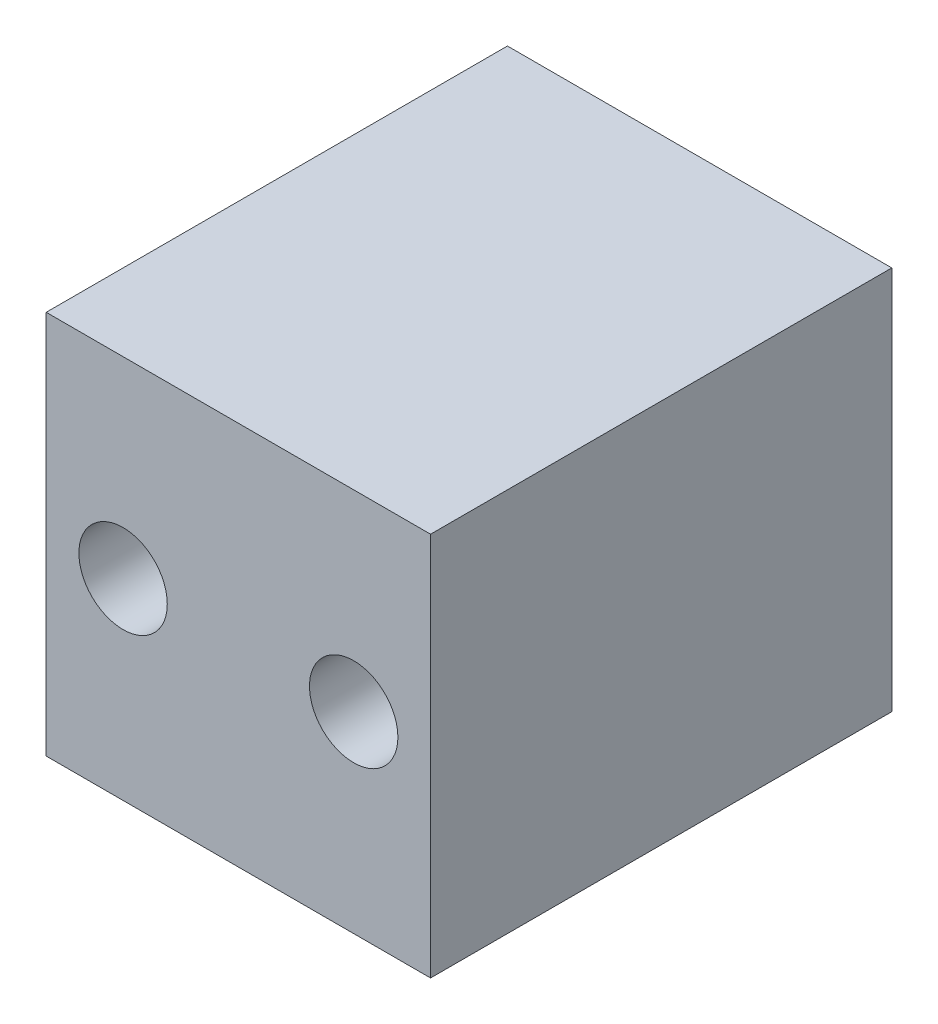
ISO-10303-21;
HEADER;
FILE_DESCRIPTION(('STEP AP214'),'2;1');
FILE_NAME('part.step','',(''),(''),'','','');
FILE_SCHEMA(('AUTOMOTIVE_DESIGN { 1 0 10303 214 1 1 1 1 }'));
ENDSEC;
DATA;
#1=APPLICATION_CONTEXT('core data for automotive mechanical design processes');
#2=APPLICATION_PROTOCOL_DEFINITION('international standard','automotive_design',2000,#1);
#3=PRODUCT_CONTEXT('',#1,'mechanical');
#4=PRODUCT('Part','Part','',(#3));
#5=PRODUCT_RELATED_PRODUCT_CATEGORY('part','',(#4));
#6=PRODUCT_DEFINITION_FORMATION('','',#4);
#7=PRODUCT_DEFINITION_CONTEXT('part definition',#1,'design');
#8=PRODUCT_DEFINITION('design','',#6,#7);
#9=PRODUCT_DEFINITION_SHAPE('','',#8);
#10=(LENGTH_UNIT() NAMED_UNIT(*) SI_UNIT(.MILLI.,.METRE.));
#11=(NAMED_UNIT(*) PLANE_ANGLE_UNIT() SI_UNIT($,.RADIAN.));
#12=(NAMED_UNIT(*) SI_UNIT($,.STERADIAN.) SOLID_ANGLE_UNIT());
#13=UNCERTAINTY_MEASURE_WITH_UNIT(LENGTH_MEASURE(1.E-05),#10,'distance_accuracy_value','');
#14=(GEOMETRIC_REPRESENTATION_CONTEXT(3) GLOBAL_UNCERTAINTY_ASSIGNED_CONTEXT((#13)) GLOBAL_UNIT_ASSIGNED_CONTEXT((#10,
#11,#12)) REPRESENTATION_CONTEXT('',''));
#15=CARTESIAN_POINT('',(0.,0.,0.));
#16=DIRECTION('',(0.,0.,1.));
#17=DIRECTION('',(1.,0.,0.));
#18=AXIS2_PLACEMENT_3D('',#15,#16,#17);
#19=CARTESIAN_POINT('',(-50.,-50.,120.));
#20=DIRECTION('',(1.,0.,0.));
#21=DIRECTION('',(0.,0.,-1.));
#22=AXIS2_PLACEMENT_3D('',#19,#20,#21);
#23=PLANE('',#22);
#24=DIRECTION('',(0.,-1.,0.));
#25=VECTOR('',#24,1.);
#26=CARTESIAN_POINT('',(-50.,-50.,0.));
#27=LINE('',#26,#25);
#28=CARTESIAN_POINT('',(-50.,50.,0.));
#29=VERTEX_POINT('',#28);
#30=CARTESIAN_POINT('',(-50.,-50.,0.));
#31=VERTEX_POINT('',#30);
#32=EDGE_CURVE('E96',#29,#31,#27,.T.);
#33=ORIENTED_EDGE('',*,*,#32,.T.);
#34=DIRECTION('',(0.,0.,-1.));
#35=VECTOR('',#34,1.);
#36=CARTESIAN_POINT('',(-50.,-50.,120.));
#37=LINE('',#36,#35);
#38=CARTESIAN_POINT('',(-50.,-50.,120.));
#39=VERTEX_POINT('',#38);
#40=EDGE_CURVE('E11',#39,#31,#37,.T.);
#41=ORIENTED_EDGE('',*,*,#40,.F.);
#42=DIRECTION('',(0.,-1.,0.));
#43=VECTOR('',#42,1.);
#44=CARTESIAN_POINT('',(-50.,-50.,120.));
#45=LINE('',#44,#43);
#46=CARTESIAN_POINT('',(-50.,50.,120.));
#47=VERTEX_POINT('',#46);
#48=EDGE_CURVE('E84',#47,#39,#45,.T.);
#49=ORIENTED_EDGE('',*,*,#48,.F.);
#50=DIRECTION('',(0.,0.,-1.));
#51=VECTOR('',#50,1.);
#52=CARTESIAN_POINT('',(-50.,50.,120.));
#53=LINE('',#52,#51);
#54=EDGE_CURVE('E92',#47,#29,#53,.T.);
#55=ORIENTED_EDGE('',*,*,#54,.T.);
#56=EDGE_LOOP('',(#33,#41,#49,#55));
#57=FACE_BOUND('',#56,.T.);
#58=ADVANCED_FACE('F33',(#57),#23,.F.);
#59=CARTESIAN_POINT('',(50.,-50.,120.));
#60=DIRECTION('',(0.,1.,0.));
#61=DIRECTION('',(-1.,0.,0.));
#62=AXIS2_PLACEMENT_3D('',#59,#60,#61);
#63=PLANE('',#62);
#64=DIRECTION('',(1.,0.,0.));
#65=VECTOR('',#64,1.);
#66=CARTESIAN_POINT('',(50.,-50.,0.));
#67=LINE('',#66,#65);
#68=CARTESIAN_POINT('',(50.,-50.,0.));
#69=VERTEX_POINT('',#68);
#70=EDGE_CURVE('E88',#31,#69,#67,.T.);
#71=ORIENTED_EDGE('',*,*,#70,.T.);
#72=DIRECTION('',(0.,0.,-1.));
#73=VECTOR('',#72,1.);
#74=CARTESIAN_POINT('',(50.,-50.,120.));
#75=LINE('',#74,#73);
#76=CARTESIAN_POINT('',(50.,-50.,120.));
#77=VERTEX_POINT('',#76);
#78=EDGE_CURVE('E41',#77,#69,#75,.T.);
#79=ORIENTED_EDGE('',*,*,#78,.F.);
#80=DIRECTION('',(1.,0.,0.));
#81=VECTOR('',#80,1.);
#82=CARTESIAN_POINT('',(50.,-50.,120.));
#83=LINE('',#82,#81);
#84=EDGE_CURVE('E79',#39,#77,#83,.T.);
#85=ORIENTED_EDGE('',*,*,#84,.F.);
#86=ORIENTED_EDGE('',*,*,#40,.T.);
#87=EDGE_LOOP('',(#71,#79,#85,#86));
#88=FACE_BOUND('',#87,.T.);
#89=ADVANCED_FACE('F87',(#88),#63,.F.);
#90=CARTESIAN_POINT('',(50.,-50.,120.));
#91=DIRECTION('',(-1.,0.,0.));
#92=DIRECTION('',(0.,0.,1.));
#93=AXIS2_PLACEMENT_3D('',#90,#91,#92);
#94=PLANE('',#93);
#95=DIRECTION('',(0.,1.,0.));
#96=VECTOR('',#95,1.);
#97=CARTESIAN_POINT('',(50.,-50.,0.));
#98=LINE('',#97,#96);
#99=CARTESIAN_POINT('',(50.,50.,0.));
#100=VERTEX_POINT('',#99);
#101=EDGE_CURVE('E66',#69,#100,#98,.T.);
#102=ORIENTED_EDGE('',*,*,#101,.T.);
#103=DIRECTION('',(0.,0.,-1.));
#104=VECTOR('',#103,1.);
#105=CARTESIAN_POINT('',(50.,50.,120.));
#106=LINE('',#105,#104);
#107=CARTESIAN_POINT('',(50.,50.,120.));
#108=VERTEX_POINT('',#107);
#109=EDGE_CURVE('E89',#108,#100,#106,.T.);
#110=ORIENTED_EDGE('',*,*,#109,.F.);
#111=DIRECTION('',(0.,1.,0.));
#112=VECTOR('',#111,1.);
#113=CARTESIAN_POINT('',(50.,-50.,120.));
#114=LINE('',#113,#112);
#115=EDGE_CURVE('E82',#77,#108,#114,.T.);
#116=ORIENTED_EDGE('',*,*,#115,.F.);
#117=ORIENTED_EDGE('',*,*,#78,.T.);
#118=EDGE_LOOP('',(#102,#110,#116,#117));
#119=FACE_BOUND('',#118,.T.);
#120=ADVANCED_FACE('F90',(#119),#94,.F.);
#121=CARTESIAN_POINT('',(50.,50.,120.));
#122=DIRECTION('',(0.,-1.,0.));
#123=DIRECTION('',(1.,0.,0.));
#124=AXIS2_PLACEMENT_3D('',#121,#122,#123);
#125=PLANE('',#124);
#126=DIRECTION('',(-1.,0.,0.));
#127=VECTOR('',#126,1.);
#128=CARTESIAN_POINT('',(50.,50.,0.));
#129=LINE('',#128,#127);
#130=EDGE_CURVE('E72',#100,#29,#129,.T.);
#131=ORIENTED_EDGE('',*,*,#130,.T.);
#132=ORIENTED_EDGE('',*,*,#54,.F.);
#133=DIRECTION('',(-1.,0.,0.));
#134=VECTOR('',#133,1.);
#135=CARTESIAN_POINT('',(50.,50.,120.));
#136=LINE('',#135,#134);
#137=EDGE_CURVE('E49',#108,#47,#136,.T.);
#138=ORIENTED_EDGE('',*,*,#137,.F.);
#139=ORIENTED_EDGE('',*,*,#109,.T.);
#140=EDGE_LOOP('',(#131,#132,#138,#139));
#141=FACE_BOUND('',#140,.T.);
#142=ADVANCED_FACE('F104',(#141),#125,.F.);
#143=CARTESIAN_POINT('',(0.,0.,120.));
#144=DIRECTION('',(0.,0.,1.));
#145=DIRECTION('',(1.,0.,0.));
#146=AXIS2_PLACEMENT_3D('',#143,#144,#145);
#147=PLANE('',#146);
#148=CARTESIAN_POINT('',(30.,0.,120.));
#149=DIRECTION('',(0.,0.,1.));
#150=DIRECTION('',(1.,0.,0.));
#151=AXIS2_PLACEMENT_3D('',#148,#149,#150);
#152=CIRCLE('',#151,11.5);
#153=CARTESIAN_POINT('',(41.5,0.,120.));
#154=VERTEX_POINT('',#153);
#155=EDGE_CURVE('E130',#154,#154,#152,.T.);
#156=ORIENTED_EDGE('',*,*,#155,.F.);
#157=EDGE_LOOP('',(#156));
#158=FACE_BOUND('',#157,.T.);
#159=CARTESIAN_POINT('',(-30.,0.,120.));
#160=DIRECTION('',(0.,0.,1.));
#161=DIRECTION('',(1.,0.,0.));
#162=AXIS2_PLACEMENT_3D('',#159,#160,#161);
#163=CIRCLE('',#162,11.5);
#164=CARTESIAN_POINT('',(-18.5,0.,120.));
#165=VERTEX_POINT('',#164);
#166=EDGE_CURVE('E118',#165,#165,#163,.T.);
#167=ORIENTED_EDGE('',*,*,#166,.F.);
#168=EDGE_LOOP('',(#167));
#169=FACE_BOUND('',#168,.T.);
#170=ORIENTED_EDGE('',*,*,#48,.T.);
#171=ORIENTED_EDGE('',*,*,#84,.T.);
#172=ORIENTED_EDGE('',*,*,#115,.T.);
#173=ORIENTED_EDGE('',*,*,#137,.T.);
#174=EDGE_LOOP('',(#170,#171,#172,#173));
#175=FACE_BOUND('',#174,.T.);
#176=ADVANCED_FACE('F80',(#158,#169,#175),#147,.T.);
#177=CARTESIAN_POINT('',(0.,0.,0.));
#178=DIRECTION('',(0.,0.,1.));
#179=DIRECTION('',(1.,0.,0.));
#180=AXIS2_PLACEMENT_3D('',#177,#178,#179);
#181=PLANE('',#180);
#182=CARTESIAN_POINT('',(30.,0.,0.));
#183=DIRECTION('',(0.,0.,1.));
#184=DIRECTION('',(1.,0.,0.));
#185=AXIS2_PLACEMENT_3D('',#182,#183,#184);
#186=CIRCLE('',#185,4.49999999999997);
#187=CARTESIAN_POINT('',(34.5,0.,0.));
#188=VERTEX_POINT('',#187);
#189=EDGE_CURVE('E121',#188,#188,#186,.T.);
#190=ORIENTED_EDGE('',*,*,#189,.T.);
#191=EDGE_LOOP('',(#190));
#192=FACE_BOUND('',#191,.T.);
#193=CARTESIAN_POINT('',(-30.,0.,0.));
#194=DIRECTION('',(0.,0.,1.));
#195=DIRECTION('',(1.,0.,0.));
#196=AXIS2_PLACEMENT_3D('',#193,#194,#195);
#197=CIRCLE('',#196,4.49999999999997);
#198=CARTESIAN_POINT('',(-25.5,0.,0.));
#199=VERTEX_POINT('',#198);
#200=EDGE_CURVE('E99',#199,#199,#197,.T.);
#201=ORIENTED_EDGE('',*,*,#200,.T.);
#202=EDGE_LOOP('',(#201));
#203=FACE_BOUND('',#202,.T.);
#204=ORIENTED_EDGE('',*,*,#32,.F.);
#205=ORIENTED_EDGE('',*,*,#130,.F.);
#206=ORIENTED_EDGE('',*,*,#101,.F.);
#207=ORIENTED_EDGE('',*,*,#70,.F.);
#208=EDGE_LOOP('',(#204,#205,#206,#207));
#209=FACE_BOUND('',#208,.T.);
#210=ADVANCED_FACE('F107',(#192,#203,#209),#181,.F.);
#211=CARTESIAN_POINT('',(-30.,0.,120.));
#212=DIRECTION('',(0.,0.,1.));
#213=DIRECTION('',(1.,0.,0.));
#214=AXIS2_PLACEMENT_3D('',#211,#212,#213);
#215=CYLINDRICAL_SURFACE('',#214,4.49999999999997);
#216=ORIENTED_EDGE('',*,*,#200,.F.);
#217=EDGE_LOOP('',(#216));
#218=FACE_BOUND('',#217,.T.);
#219=CARTESIAN_POINT('',(-30.,0.,9.99999999999999));
#220=DIRECTION('',(0.,0.,1.));
#221=DIRECTION('',(1.,0.,0.));
#222=AXIS2_PLACEMENT_3D('',#219,#220,#221);
#223=CIRCLE('',#222,4.49999999999997);
#224=CARTESIAN_POINT('',(-25.5,0.,9.99999999999999));
#225=VERTEX_POINT('',#224);
#226=EDGE_CURVE('E112',#225,#225,#223,.T.);
#227=ORIENTED_EDGE('',*,*,#226,.T.);
#228=EDGE_LOOP('',(#227));
#229=FACE_BOUND('',#228,.T.);
#230=ADVANCED_FACE('F154',(#218,#229),#215,.F.);
#231=CARTESIAN_POINT('',(-25.5,0.,9.99999999999999));
#232=DIRECTION('',(0.,0.,-1.));
#233=DIRECTION('',(-1.,0.,0.));
#234=AXIS2_PLACEMENT_3D('',#231,#232,#233);
#235=PLANE('',#234);
#236=ORIENTED_EDGE('',*,*,#226,.F.);
#237=EDGE_LOOP('',(#236));
#238=FACE_BOUND('',#237,.T.);
#239=CARTESIAN_POINT('',(-30.,0.,9.99999999999999));
#240=DIRECTION('',(0.,0.,1.));
#241=DIRECTION('',(1.,0.,0.));
#242=AXIS2_PLACEMENT_3D('',#239,#240,#241);
#243=CIRCLE('',#242,11.5);
#244=CARTESIAN_POINT('',(-18.5,0.,9.99999999999999));
#245=VERTEX_POINT('',#244);
#246=EDGE_CURVE('E115',#245,#245,#243,.T.);
#247=ORIENTED_EDGE('',*,*,#246,.T.);
#248=EDGE_LOOP('',(#247));
#249=FACE_BOUND('',#248,.T.);
#250=ADVANCED_FACE('F144',(#238,#249),#235,.F.);
#251=CARTESIAN_POINT('',(-30.,0.,120.));
#252=DIRECTION('',(0.,0.,1.));
#253=DIRECTION('',(1.,0.,0.));
#254=AXIS2_PLACEMENT_3D('',#251,#252,#253);
#255=CYLINDRICAL_SURFACE('',#254,11.5);
#256=ORIENTED_EDGE('',*,*,#246,.F.);
#257=EDGE_LOOP('',(#256));
#258=FACE_BOUND('',#257,.T.);
#259=ORIENTED_EDGE('',*,*,#166,.T.);
#260=EDGE_LOOP('',(#259));
#261=FACE_BOUND('',#260,.T.);
#262=ADVANCED_FACE('F141',(#258,#261),#255,.F.);
#263=CARTESIAN_POINT('',(30.,0.,120.));
#264=DIRECTION('',(0.,0.,1.));
#265=DIRECTION('',(1.,0.,0.));
#266=AXIS2_PLACEMENT_3D('',#263,#264,#265);
#267=CYLINDRICAL_SURFACE('',#266,4.49999999999997);
#268=ORIENTED_EDGE('',*,*,#189,.F.);
#269=EDGE_LOOP('',(#268));
#270=FACE_BOUND('',#269,.T.);
#271=CARTESIAN_POINT('',(30.,0.,9.99999999999999));
#272=DIRECTION('',(0.,0.,1.));
#273=DIRECTION('',(1.,0.,0.));
#274=AXIS2_PLACEMENT_3D('',#271,#272,#273);
#275=CIRCLE('',#274,4.49999999999997);
#276=CARTESIAN_POINT('',(34.5,0.,9.99999999999999));
#277=VERTEX_POINT('',#276);
#278=EDGE_CURVE('E124',#277,#277,#275,.T.);
#279=ORIENTED_EDGE('',*,*,#278,.T.);
#280=EDGE_LOOP('',(#279));
#281=FACE_BOUND('',#280,.T.);
#282=ADVANCED_FACE('F143',(#270,#281),#267,.F.);
#283=CARTESIAN_POINT('',(34.5,0.,9.99999999999999));
#284=DIRECTION('',(0.,0.,-1.));
#285=DIRECTION('',(-1.,0.,0.));
#286=AXIS2_PLACEMENT_3D('',#283,#284,#285);
#287=PLANE('',#286);
#288=ORIENTED_EDGE('',*,*,#278,.F.);
#289=EDGE_LOOP('',(#288));
#290=FACE_BOUND('',#289,.T.);
#291=CARTESIAN_POINT('',(30.,0.,9.99999999999999));
#292=DIRECTION('',(0.,0.,1.));
#293=DIRECTION('',(1.,0.,0.));
#294=AXIS2_PLACEMENT_3D('',#291,#292,#293);
#295=CIRCLE('',#294,11.5);
#296=CARTESIAN_POINT('',(41.5,0.,9.99999999999999));
#297=VERTEX_POINT('',#296);
#298=EDGE_CURVE('E127',#297,#297,#295,.T.);
#299=ORIENTED_EDGE('',*,*,#298,.T.);
#300=EDGE_LOOP('',(#299));
#301=FACE_BOUND('',#300,.T.);
#302=ADVANCED_FACE('F151',(#290,#301),#287,.F.);
#303=CARTESIAN_POINT('',(30.,0.,120.));
#304=DIRECTION('',(0.,0.,1.));
#305=DIRECTION('',(1.,0.,0.));
#306=AXIS2_PLACEMENT_3D('',#303,#304,#305);
#307=CYLINDRICAL_SURFACE('',#306,11.5);
#308=ORIENTED_EDGE('',*,*,#298,.F.);
#309=EDGE_LOOP('',(#308));
#310=FACE_BOUND('',#309,.T.);
#311=ORIENTED_EDGE('',*,*,#155,.T.);
#312=EDGE_LOOP('',(#311));
#313=FACE_BOUND('',#312,.T.);
#314=ADVANCED_FACE('F134',(#310,#313),#307,.F.);
#315=CLOSED_SHELL('',(#58,#89,#120,#142,#176,#210,#230,#250,#262,#282,#302,#314));
#316=MANIFOLD_SOLID_BREP('B2',#315);
#317=ADVANCED_BREP_SHAPE_REPRESENTATION('',(#18,#316),#14);
#318=SHAPE_DEFINITION_REPRESENTATION(#9,#317);
ENDSEC;
END-ISO-10303-21;
